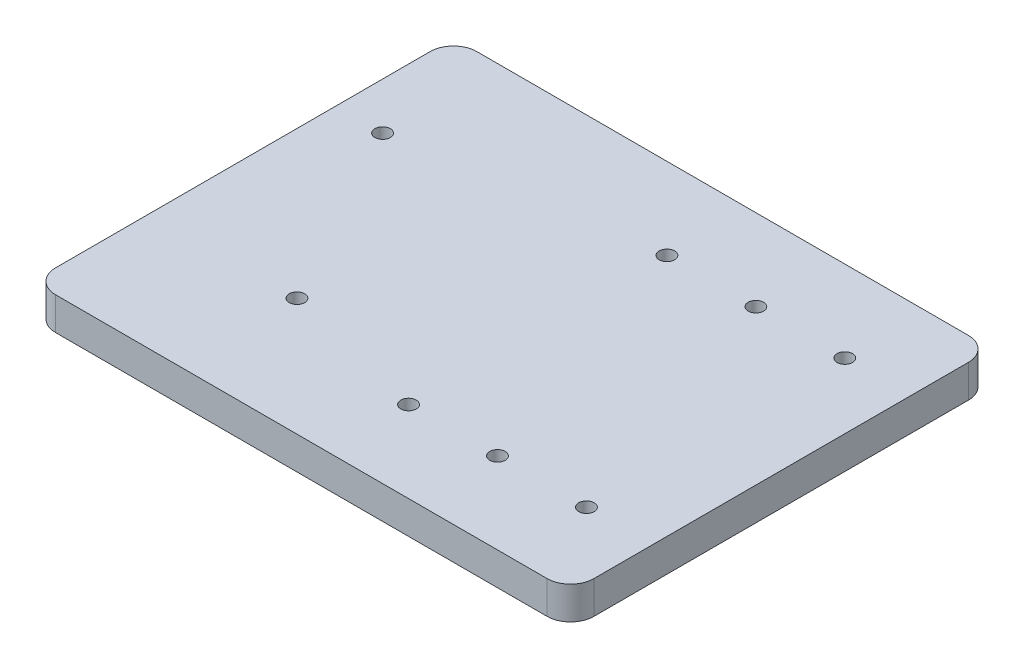
ISO-10303-21;
HEADER;
FILE_DESCRIPTION(('STEP AP214'),'2;1');
FILE_NAME('part.step','',(''),(''),'','','');
FILE_SCHEMA(('AUTOMOTIVE_DESIGN { 1 0 10303 214 1 1 1 1 }'));
ENDSEC;
DATA;
#1=APPLICATION_CONTEXT('core data for automotive mechanical design processes');
#2=APPLICATION_PROTOCOL_DEFINITION('international standard','automotive_design',2000,#1);
#3=PRODUCT_CONTEXT('',#1,'mechanical');
#4=PRODUCT('Part','Part','',(#3));
#5=PRODUCT_RELATED_PRODUCT_CATEGORY('part','',(#4));
#6=PRODUCT_DEFINITION_FORMATION('','',#4);
#7=PRODUCT_DEFINITION_CONTEXT('part definition',#1,'design');
#8=PRODUCT_DEFINITION('design','',#6,#7);
#9=PRODUCT_DEFINITION_SHAPE('','',#8);
#10=(LENGTH_UNIT() NAMED_UNIT(*) SI_UNIT(.MILLI.,.METRE.));
#11=(NAMED_UNIT(*) PLANE_ANGLE_UNIT() SI_UNIT($,.RADIAN.));
#12=(NAMED_UNIT(*) SI_UNIT($,.STERADIAN.) SOLID_ANGLE_UNIT());
#13=UNCERTAINTY_MEASURE_WITH_UNIT(LENGTH_MEASURE(1.E-05),#10,'distance_accuracy_value','');
#14=(GEOMETRIC_REPRESENTATION_CONTEXT(3) GLOBAL_UNCERTAINTY_ASSIGNED_CONTEXT((#13)) GLOBAL_UNIT_ASSIGNED_CONTEXT((#10,
#11,#12)) REPRESENTATION_CONTEXT('',''));
#15=CARTESIAN_POINT('',(0.,0.,0.));
#16=DIRECTION('',(0.,0.,1.));
#17=DIRECTION('',(1.,0.,0.));
#18=AXIS2_PLACEMENT_3D('',#15,#16,#17);
#19=CARTESIAN_POINT('',(10.,7.,-64.85));
#20=DIRECTION('',(0.,-1.,0.));
#21=DIRECTION('',(0.,0.,-1.));
#22=AXIS2_PLACEMENT_3D('',#19,#20,#21);
#23=CYLINDRICAL_SURFACE('',#22,1.65);
#24=CARTESIAN_POINT('',(10.,7.,-64.85));
#25=DIRECTION('',(0.,1.,0.));
#26=DIRECTION('',(0.,0.,1.));
#27=AXIS2_PLACEMENT_3D('',#24,#25,#26);
#28=CIRCLE('',#27,1.65);
#29=CARTESIAN_POINT('',(10.,7.,-63.2));
#30=VERTEX_POINT('',#29);
#31=EDGE_CURVE('E208',#30,#30,#28,.T.);
#32=ORIENTED_EDGE('',*,*,#31,.T.);
#33=EDGE_LOOP('',(#32));
#34=FACE_BOUND('',#33,.T.);
#35=CARTESIAN_POINT('',(10.,4.,-64.85));
#36=DIRECTION('',(0.,-1.,0.));
#37=DIRECTION('',(0.,0.,-1.));
#38=AXIS2_PLACEMENT_3D('',#35,#36,#37);
#39=CIRCLE('',#38,1.65);
#40=CARTESIAN_POINT('',(10.,4.,-66.5));
#41=VERTEX_POINT('',#40);
#42=EDGE_CURVE('E36',#41,#41,#39,.T.);
#43=ORIENTED_EDGE('',*,*,#42,.T.);
#44=EDGE_LOOP('',(#43));
#45=FACE_BOUND('',#44,.T.);
#46=ADVANCED_FACE('F32',(#34,#45),#23,.F.);
#47=CARTESIAN_POINT('',(31.4,7.,-25.15));
#48=DIRECTION('',(0.,-1.,0.));
#49=DIRECTION('',(0.,0.,-1.));
#50=AXIS2_PLACEMENT_3D('',#47,#48,#49);
#51=CYLINDRICAL_SURFACE('',#50,1.65);
#52=CARTESIAN_POINT('',(31.4,7.,-25.15));
#53=DIRECTION('',(0.,1.,0.));
#54=DIRECTION('',(0.,0.,1.));
#55=AXIS2_PLACEMENT_3D('',#52,#53,#54);
#56=CIRCLE('',#55,1.65);
#57=CARTESIAN_POINT('',(31.4,7.,-23.5));
#58=VERTEX_POINT('',#57);
#59=EDGE_CURVE('E205',#58,#58,#56,.T.);
#60=ORIENTED_EDGE('',*,*,#59,.T.);
#61=EDGE_LOOP('',(#60));
#62=FACE_BOUND('',#61,.T.);
#63=CARTESIAN_POINT('',(31.4,4.,-25.15));
#64=DIRECTION('',(0.,-1.,0.));
#65=DIRECTION('',(0.,0.,-1.));
#66=AXIS2_PLACEMENT_3D('',#63,#64,#65);
#67=CIRCLE('',#66,1.65);
#68=CARTESIAN_POINT('',(31.4,4.,-26.8));
#69=VERTEX_POINT('',#68);
#70=EDGE_CURVE('E174',#69,#69,#67,.T.);
#71=ORIENTED_EDGE('',*,*,#70,.T.);
#72=EDGE_LOOP('',(#71));
#73=FACE_BOUND('',#72,.T.);
#74=ADVANCED_FACE('F242',(#62,#73),#51,.F.);
#75=CARTESIAN_POINT('',(101.,7.,-17.4));
#76=DIRECTION('',(0.,-1.,0.));
#77=DIRECTION('',(0.,0.,-1.));
#78=AXIS2_PLACEMENT_3D('',#75,#76,#77);
#79=CYLINDRICAL_SURFACE('',#78,1.65);
#80=CARTESIAN_POINT('',(101.,7.,-17.4));
#81=DIRECTION('',(0.,-1.,0.));
#82=DIRECTION('',(0.,0.,-1.));
#83=AXIS2_PLACEMENT_3D('',#80,#81,#82);
#84=CIRCLE('',#83,1.65);
#85=CARTESIAN_POINT('',(101.,7.,-19.05));
#86=VERTEX_POINT('',#85);
#87=EDGE_CURVE('E200',#86,#86,#84,.T.);
#88=ORIENTED_EDGE('',*,*,#87,.F.);
#89=EDGE_LOOP('',(#88));
#90=FACE_BOUND('',#89,.T.);
#91=CARTESIAN_POINT('',(101.,4.,-17.4));
#92=DIRECTION('',(0.,-1.,0.));
#93=DIRECTION('',(0.,0.,-1.));
#94=AXIS2_PLACEMENT_3D('',#91,#92,#93);
#95=CIRCLE('',#94,1.65);
#96=CARTESIAN_POINT('',(101.,4.,-19.05));
#97=VERTEX_POINT('',#96);
#98=EDGE_CURVE('E172',#97,#97,#95,.F.);
#99=ORIENTED_EDGE('',*,*,#98,.F.);
#100=EDGE_LOOP('',(#99));
#101=FACE_BOUND('',#100,.T.);
#102=ADVANCED_FACE('F248',(#90,#101),#79,.F.);
#103=CARTESIAN_POINT('',(63.,7.,-72.6));
#104=DIRECTION('',(0.,-1.,0.));
#105=DIRECTION('',(0.,0.,-1.));
#106=AXIS2_PLACEMENT_3D('',#103,#104,#105);
#107=CYLINDRICAL_SURFACE('',#106,1.65);
#108=CARTESIAN_POINT('',(63.,7.,-72.6));
#109=DIRECTION('',(0.,-1.,0.));
#110=DIRECTION('',(0.,0.,-1.));
#111=AXIS2_PLACEMENT_3D('',#108,#109,#110);
#112=CIRCLE('',#111,1.65);
#113=CARTESIAN_POINT('',(63.,7.,-74.25));
#114=VERTEX_POINT('',#113);
#115=EDGE_CURVE('E179',#114,#114,#112,.T.);
#116=ORIENTED_EDGE('',*,*,#115,.F.);
#117=EDGE_LOOP('',(#116));
#118=FACE_BOUND('',#117,.T.);
#119=CARTESIAN_POINT('',(63.,4.,-72.6));
#120=DIRECTION('',(0.,-1.,0.));
#121=DIRECTION('',(0.,0.,-1.));
#122=AXIS2_PLACEMENT_3D('',#119,#120,#121);
#123=CIRCLE('',#122,1.65);
#124=CARTESIAN_POINT('',(63.,4.,-74.25));
#125=VERTEX_POINT('',#124);
#126=EDGE_CURVE('E169',#125,#125,#123,.F.);
#127=ORIENTED_EDGE('',*,*,#126,.F.);
#128=EDGE_LOOP('',(#127));
#129=FACE_BOUND('',#128,.T.);
#130=ADVANCED_FACE('F326',(#118,#129),#107,.F.);
#131=CARTESIAN_POINT('',(101.,7.,-72.6));
#132=DIRECTION('',(0.,-1.,0.));
#133=DIRECTION('',(0.,0.,-1.));
#134=AXIS2_PLACEMENT_3D('',#131,#132,#133);
#135=CYLINDRICAL_SURFACE('',#134,1.65);
#136=CARTESIAN_POINT('',(101.,7.,-72.6));
#137=DIRECTION('',(0.,-1.,0.));
#138=DIRECTION('',(0.,0.,-1.));
#139=AXIS2_PLACEMENT_3D('',#136,#137,#138);
#140=CIRCLE('',#139,1.65);
#141=CARTESIAN_POINT('',(101.,7.,-74.25));
#142=VERTEX_POINT('',#141);
#143=EDGE_CURVE('E197',#142,#142,#140,.T.);
#144=ORIENTED_EDGE('',*,*,#143,.F.);
#145=EDGE_LOOP('',(#144));
#146=FACE_BOUND('',#145,.T.);
#147=CARTESIAN_POINT('',(101.,4.,-72.6));
#148=DIRECTION('',(0.,-1.,0.));
#149=DIRECTION('',(0.,0.,-1.));
#150=AXIS2_PLACEMENT_3D('',#147,#148,#149);
#151=CIRCLE('',#150,1.65);
#152=CARTESIAN_POINT('',(101.,4.,-74.25));
#153=VERTEX_POINT('',#152);
#154=EDGE_CURVE('E166',#153,#153,#151,.F.);
#155=ORIENTED_EDGE('',*,*,#154,.F.);
#156=EDGE_LOOP('',(#155));
#157=FACE_BOUND('',#156,.T.);
#158=ADVANCED_FACE('F329',(#146,#157),#135,.F.);
#159=CARTESIAN_POINT('',(82.,7.,-17.4));
#160=DIRECTION('',(0.,-1.,0.));
#161=DIRECTION('',(0.,0.,-1.));
#162=AXIS2_PLACEMENT_3D('',#159,#160,#161);
#163=CYLINDRICAL_SURFACE('',#162,1.65);
#164=CARTESIAN_POINT('',(82.,7.,-17.4));
#165=DIRECTION('',(0.,-1.,0.));
#166=DIRECTION('',(0.,0.,-1.));
#167=AXIS2_PLACEMENT_3D('',#164,#165,#166);
#168=CIRCLE('',#167,1.65);
#169=CARTESIAN_POINT('',(82.,7.,-19.05));
#170=VERTEX_POINT('',#169);
#171=EDGE_CURVE('E195',#170,#170,#168,.T.);
#172=ORIENTED_EDGE('',*,*,#171,.F.);
#173=EDGE_LOOP('',(#172));
#174=FACE_BOUND('',#173,.T.);
#175=CARTESIAN_POINT('',(82.,4.,-17.4));
#176=DIRECTION('',(0.,-1.,0.));
#177=DIRECTION('',(0.,0.,-1.));
#178=AXIS2_PLACEMENT_3D('',#175,#176,#177);
#179=CIRCLE('',#178,1.65);
#180=CARTESIAN_POINT('',(82.,4.,-19.05));
#181=VERTEX_POINT('',#180);
#182=EDGE_CURVE('E163',#181,#181,#179,.F.);
#183=ORIENTED_EDGE('',*,*,#182,.F.);
#184=EDGE_LOOP('',(#183));
#185=FACE_BOUND('',#184,.T.);
#186=ADVANCED_FACE('F334',(#174,#185),#163,.F.);
#187=CARTESIAN_POINT('',(82.,7.,-72.6));
#188=DIRECTION('',(0.,-1.,0.));
#189=DIRECTION('',(0.,0.,-1.));
#190=AXIS2_PLACEMENT_3D('',#187,#188,#189);
#191=CYLINDRICAL_SURFACE('',#190,1.65);
#192=CARTESIAN_POINT('',(82.,7.,-72.6));
#193=DIRECTION('',(0.,-1.,0.));
#194=DIRECTION('',(0.,0.,-1.));
#195=AXIS2_PLACEMENT_3D('',#192,#193,#194);
#196=CIRCLE('',#195,1.65);
#197=CARTESIAN_POINT('',(82.,7.,-74.25));
#198=VERTEX_POINT('',#197);
#199=EDGE_CURVE('E188',#198,#198,#196,.T.);
#200=ORIENTED_EDGE('',*,*,#199,.F.);
#201=EDGE_LOOP('',(#200));
#202=FACE_BOUND('',#201,.T.);
#203=CARTESIAN_POINT('',(82.,4.,-72.6));
#204=DIRECTION('',(0.,-1.,0.));
#205=DIRECTION('',(0.,0.,-1.));
#206=AXIS2_PLACEMENT_3D('',#203,#204,#205);
#207=CIRCLE('',#206,1.65);
#208=CARTESIAN_POINT('',(82.,4.,-74.25));
#209=VERTEX_POINT('',#208);
#210=EDGE_CURVE('E159',#209,#209,#207,.F.);
#211=ORIENTED_EDGE('',*,*,#210,.F.);
#212=EDGE_LOOP('',(#211));
#213=FACE_BOUND('',#212,.T.);
#214=ADVANCED_FACE('F331',(#202,#213),#191,.F.);
#215=CARTESIAN_POINT('',(63.,7.,-17.4));
#216=DIRECTION('',(0.,-1.,0.));
#217=DIRECTION('',(0.,0.,-1.));
#218=AXIS2_PLACEMENT_3D('',#215,#216,#217);
#219=CYLINDRICAL_SURFACE('',#218,1.65);
#220=CARTESIAN_POINT('',(63.,7.,-17.4));
#221=DIRECTION('',(0.,-1.,0.));
#222=DIRECTION('',(0.,0.,-1.));
#223=AXIS2_PLACEMENT_3D('',#220,#221,#222);
#224=CIRCLE('',#223,1.65);
#225=CARTESIAN_POINT('',(63.,7.,-19.05));
#226=VERTEX_POINT('',#225);
#227=EDGE_CURVE('E183',#226,#226,#224,.T.);
#228=ORIENTED_EDGE('',*,*,#227,.F.);
#229=EDGE_LOOP('',(#228));
#230=FACE_BOUND('',#229,.T.);
#231=CARTESIAN_POINT('',(63.,4.,-17.4));
#232=DIRECTION('',(0.,-1.,0.));
#233=DIRECTION('',(0.,0.,-1.));
#234=AXIS2_PLACEMENT_3D('',#231,#232,#233);
#235=CIRCLE('',#234,1.65);
#236=CARTESIAN_POINT('',(63.,4.,-19.05));
#237=VERTEX_POINT('',#236);
#238=EDGE_CURVE('E156',#237,#237,#235,.F.);
#239=ORIENTED_EDGE('',*,*,#238,.F.);
#240=EDGE_LOOP('',(#239));
#241=FACE_BOUND('',#240,.T.);
#242=ADVANCED_FACE('F255',(#230,#241),#219,.F.);
#243=CARTESIAN_POINT('',(0.,7.,0.));
#244=DIRECTION('',(0.,-1.,0.));
#245=DIRECTION('',(0.,0.,-1.));
#246=AXIS2_PLACEMENT_3D('',#243,#244,#245);
#247=PLANE('',#246);
#248=ORIENTED_EDGE('',*,*,#227,.T.);
#249=EDGE_LOOP('',(#248));
#250=FACE_BOUND('',#249,.T.);
#251=ORIENTED_EDGE('',*,*,#199,.T.);
#252=EDGE_LOOP('',(#251));
#253=FACE_BOUND('',#252,.T.);
#254=ORIENTED_EDGE('',*,*,#171,.T.);
#255=EDGE_LOOP('',(#254));
#256=FACE_BOUND('',#255,.T.);
#257=ORIENTED_EDGE('',*,*,#143,.T.);
#258=EDGE_LOOP('',(#257));
#259=FACE_BOUND('',#258,.T.);
#260=ORIENTED_EDGE('',*,*,#115,.T.);
#261=EDGE_LOOP('',(#260));
#262=FACE_BOUND('',#261,.T.);
#263=ORIENTED_EDGE('',*,*,#87,.T.);
#264=EDGE_LOOP('',(#263));
#265=FACE_BOUND('',#264,.T.);
#266=DIRECTION('',(1.,0.,0.));
#267=VECTOR('',#266,1.);
#268=CARTESIAN_POINT('',(0.,7.,0.));
#269=LINE('',#268,#267);
#270=CARTESIAN_POINT('',(5.,7.,0.));
#271=VERTEX_POINT('',#270);
#272=CARTESIAN_POINT('',(110.,7.,0.));
#273=VERTEX_POINT('',#272);
#274=EDGE_CURVE('E213',#271,#273,#269,.T.);
#275=ORIENTED_EDGE('',*,*,#274,.T.);
#276=CARTESIAN_POINT('',(110.,7.,-5.));
#277=DIRECTION('',(0.,-1.,0.));
#278=DIRECTION('',(0.,0.,-1.));
#279=AXIS2_PLACEMENT_3D('',#276,#277,#278);
#280=CIRCLE('',#279,5.);
#281=CARTESIAN_POINT('',(115.,7.,-5.));
#282=VERTEX_POINT('',#281);
#283=EDGE_CURVE('E149',#273,#282,#280,.F.);
#284=ORIENTED_EDGE('',*,*,#283,.T.);
#285=DIRECTION('',(0.,0.,-1.));
#286=VECTOR('',#285,1.);
#287=CARTESIAN_POINT('',(115.,7.,0.));
#288=LINE('',#287,#286);
#289=CARTESIAN_POINT('',(115.,7.,-85.));
#290=VERTEX_POINT('',#289);
#291=EDGE_CURVE('E120',#282,#290,#288,.T.);
#292=ORIENTED_EDGE('',*,*,#291,.T.);
#293=CARTESIAN_POINT('',(110.,7.,-85.));
#294=DIRECTION('',(0.,-1.,0.));
#295=DIRECTION('',(0.,0.,-1.));
#296=AXIS2_PLACEMENT_3D('',#293,#294,#295);
#297=CIRCLE('',#296,5.);
#298=CARTESIAN_POINT('',(110.,7.,-90.));
#299=VERTEX_POINT('',#298);
#300=EDGE_CURVE('E56',#290,#299,#297,.F.);
#301=ORIENTED_EDGE('',*,*,#300,.T.);
#302=DIRECTION('',(-1.,0.,0.));
#303=VECTOR('',#302,1.);
#304=CARTESIAN_POINT('',(0.,7.,-90.));
#305=LINE('',#304,#303);
#306=CARTESIAN_POINT('',(5.,7.,-90.));
#307=VERTEX_POINT('',#306);
#308=EDGE_CURVE('E135',#299,#307,#305,.T.);
#309=ORIENTED_EDGE('',*,*,#308,.T.);
#310=CARTESIAN_POINT('',(5.,7.,-85.));
#311=DIRECTION('',(0.,-1.,0.));
#312=DIRECTION('',(0.,0.,-1.));
#313=AXIS2_PLACEMENT_3D('',#310,#311,#312);
#314=CIRCLE('',#313,5.);
#315=CARTESIAN_POINT('',(0.,7.,-85.));
#316=VERTEX_POINT('',#315);
#317=EDGE_CURVE('E146',#307,#316,#314,.F.);
#318=ORIENTED_EDGE('',*,*,#317,.T.);
#319=DIRECTION('',(0.,0.,1.));
#320=VECTOR('',#319,1.);
#321=CARTESIAN_POINT('',(0.,7.,0.));
#322=LINE('',#321,#320);
#323=CARTESIAN_POINT('',(0.,7.,-5.));
#324=VERTEX_POINT('',#323);
#325=EDGE_CURVE('E129',#316,#324,#322,.T.);
#326=ORIENTED_EDGE('',*,*,#325,.T.);
#327=CARTESIAN_POINT('',(5.,7.,-5.));
#328=DIRECTION('',(0.,-1.,0.));
#329=DIRECTION('',(0.,0.,-1.));
#330=AXIS2_PLACEMENT_3D('',#327,#328,#329);
#331=CIRCLE('',#330,5.);
#332=EDGE_CURVE('E144',#324,#271,#331,.F.);
#333=ORIENTED_EDGE('',*,*,#332,.T.);
#334=EDGE_LOOP('',(#275,#284,#292,#301,#309,#318,#326,#333));
#335=FACE_BOUND('',#334,.T.);
#336=ORIENTED_EDGE('',*,*,#31,.F.);
#337=EDGE_LOOP('',(#336));
#338=FACE_BOUND('',#337,.T.);
#339=ORIENTED_EDGE('',*,*,#59,.F.);
#340=EDGE_LOOP('',(#339));
#341=FACE_BOUND('',#340,.T.);
#342=ADVANCED_FACE('F228',(#250,#253,#256,#259,#262,#265,#335,#338,#341),#247,.F.);
#343=CARTESIAN_POINT('',(0.,0.,0.));
#344=DIRECTION('',(0.,-1.,0.));
#345=DIRECTION('',(0.,0.,-1.));
#346=AXIS2_PLACEMENT_3D('',#343,#344,#345);
#347=PLANE('',#346);
#348=CARTESIAN_POINT('',(101.,0.,-17.4));
#349=DIRECTION('',(0.,-1.,0.));
#350=DIRECTION('',(0.,0.,-1.));
#351=AXIS2_PLACEMENT_3D('',#348,#349,#350);
#352=CIRCLE('',#351,3.50000000000001);
#353=CARTESIAN_POINT('',(101.,0.,-20.9));
#354=VERTEX_POINT('',#353);
#355=EDGE_CURVE('E603',#354,#354,#352,.T.);
#356=ORIENTED_EDGE('',*,*,#355,.F.);
#357=EDGE_LOOP('',(#356));
#358=FACE_BOUND('',#357,.T.);
#359=CARTESIAN_POINT('',(82.,0.,-17.4));
#360=DIRECTION('',(0.,-1.,0.));
#361=DIRECTION('',(0.,0.,-1.));
#362=AXIS2_PLACEMENT_3D('',#359,#360,#361);
#363=CIRCLE('',#362,3.50000000000001);
#364=CARTESIAN_POINT('',(82.,0.,-20.9));
#365=VERTEX_POINT('',#364);
#366=EDGE_CURVE('E597',#365,#365,#363,.T.);
#367=ORIENTED_EDGE('',*,*,#366,.F.);
#368=EDGE_LOOP('',(#367));
#369=FACE_BOUND('',#368,.T.);
#370=CARTESIAN_POINT('',(63.,0.,-17.4));
#371=DIRECTION('',(0.,-1.,0.));
#372=DIRECTION('',(0.,0.,-1.));
#373=AXIS2_PLACEMENT_3D('',#370,#371,#372);
#374=CIRCLE('',#373,3.50000000000001);
#375=CARTESIAN_POINT('',(63.,0.,-20.9));
#376=VERTEX_POINT('',#375);
#377=EDGE_CURVE('E591',#376,#376,#374,.T.);
#378=ORIENTED_EDGE('',*,*,#377,.F.);
#379=EDGE_LOOP('',(#378));
#380=FACE_BOUND('',#379,.T.);
#381=CARTESIAN_POINT('',(101.,0.,-72.6));
#382=DIRECTION('',(0.,-1.,0.));
#383=DIRECTION('',(0.,0.,-1.));
#384=AXIS2_PLACEMENT_3D('',#381,#382,#383);
#385=CIRCLE('',#384,3.50000000000001);
#386=CARTESIAN_POINT('',(101.,0.,-76.1));
#387=VERTEX_POINT('',#386);
#388=EDGE_CURVE('E586',#387,#387,#385,.T.);
#389=ORIENTED_EDGE('',*,*,#388,.F.);
#390=EDGE_LOOP('',(#389));
#391=FACE_BOUND('',#390,.T.);
#392=CARTESIAN_POINT('',(82.,0.,-72.6));
#393=DIRECTION('',(0.,-1.,0.));
#394=DIRECTION('',(0.,0.,-1.));
#395=AXIS2_PLACEMENT_3D('',#392,#393,#394);
#396=CIRCLE('',#395,3.50000000000001);
#397=CARTESIAN_POINT('',(82.,0.,-76.1));
#398=VERTEX_POINT('',#397);
#399=EDGE_CURVE('E580',#398,#398,#396,.T.);
#400=ORIENTED_EDGE('',*,*,#399,.F.);
#401=EDGE_LOOP('',(#400));
#402=FACE_BOUND('',#401,.T.);
#403=CARTESIAN_POINT('',(63.,0.,-72.6));
#404=DIRECTION('',(0.,-1.,0.));
#405=DIRECTION('',(0.,0.,-1.));
#406=AXIS2_PLACEMENT_3D('',#403,#404,#405);
#407=CIRCLE('',#406,3.50000000000001);
#408=CARTESIAN_POINT('',(63.,0.,-76.1));
#409=VERTEX_POINT('',#408);
#410=EDGE_CURVE('E574',#409,#409,#407,.T.);
#411=ORIENTED_EDGE('',*,*,#410,.F.);
#412=EDGE_LOOP('',(#411));
#413=FACE_BOUND('',#412,.T.);
#414=CARTESIAN_POINT('',(10.,0.,-64.85));
#415=DIRECTION('',(0.,-1.,0.));
#416=DIRECTION('',(0.,0.,-1.));
#417=AXIS2_PLACEMENT_3D('',#414,#415,#416);
#418=CIRCLE('',#417,3.5);
#419=CARTESIAN_POINT('',(10.,0.,-68.35));
#420=VERTEX_POINT('',#419);
#421=EDGE_CURVE('E565',#420,#420,#418,.T.);
#422=ORIENTED_EDGE('',*,*,#421,.F.);
#423=EDGE_LOOP('',(#422));
#424=FACE_BOUND('',#423,.T.);
#425=CARTESIAN_POINT('',(31.4,0.,-25.15));
#426=DIRECTION('',(0.,-1.,0.));
#427=DIRECTION('',(0.,0.,-1.));
#428=AXIS2_PLACEMENT_3D('',#425,#426,#427);
#429=CIRCLE('',#428,3.5);
#430=CARTESIAN_POINT('',(31.4,0.,-28.65));
#431=VERTEX_POINT('',#430);
#432=EDGE_CURVE('E192',#431,#431,#429,.T.);
#433=ORIENTED_EDGE('',*,*,#432,.F.);
#434=EDGE_LOOP('',(#433));
#435=FACE_BOUND('',#434,.T.);
#436=DIRECTION('',(0.,0.,-1.));
#437=VECTOR('',#436,1.);
#438=CARTESIAN_POINT('',(115.,0.,0.));
#439=LINE('',#438,#437);
#440=CARTESIAN_POINT('',(115.,0.,-5.));
#441=VERTEX_POINT('',#440);
#442=CARTESIAN_POINT('',(115.,0.,-85.));
#443=VERTEX_POINT('',#442);
#444=EDGE_CURVE('E118',#441,#443,#439,.T.);
#445=ORIENTED_EDGE('',*,*,#444,.F.);
#446=CARTESIAN_POINT('',(110.,0.,-5.));
#447=DIRECTION('',(0.,-1.,0.));
#448=DIRECTION('',(0.,0.,-1.));
#449=AXIS2_PLACEMENT_3D('',#446,#447,#448);
#450=CIRCLE('',#449,5.);
#451=CARTESIAN_POINT('',(110.,0.,0.));
#452=VERTEX_POINT('',#451);
#453=EDGE_CURVE('E101',#441,#452,#450,.T.);
#454=ORIENTED_EDGE('',*,*,#453,.T.);
#455=DIRECTION('',(1.,0.,0.));
#456=VECTOR('',#455,1.);
#457=CARTESIAN_POINT('',(0.,0.,0.));
#458=LINE('',#457,#456);
#459=CARTESIAN_POINT('',(5.,0.,0.));
#460=VERTEX_POINT('',#459);
#461=EDGE_CURVE('E127',#460,#452,#458,.T.);
#462=ORIENTED_EDGE('',*,*,#461,.F.);
#463=CARTESIAN_POINT('',(5.,0.,-5.));
#464=DIRECTION('',(0.,-1.,0.));
#465=DIRECTION('',(0.,0.,-1.));
#466=AXIS2_PLACEMENT_3D('',#463,#464,#465);
#467=CIRCLE('',#466,5.);
#468=CARTESIAN_POINT('',(0.,0.,-5.));
#469=VERTEX_POINT('',#468);
#470=EDGE_CURVE('E121',#460,#469,#467,.T.);
#471=ORIENTED_EDGE('',*,*,#470,.T.);
#472=DIRECTION('',(0.,0.,1.));
#473=VECTOR('',#472,1.);
#474=CARTESIAN_POINT('',(0.,0.,0.));
#475=LINE('',#474,#473);
#476=CARTESIAN_POINT('',(0.,0.,-85.));
#477=VERTEX_POINT('',#476);
#478=EDGE_CURVE('E131',#477,#469,#475,.T.);
#479=ORIENTED_EDGE('',*,*,#478,.F.);
#480=CARTESIAN_POINT('',(5.,0.,-85.));
#481=DIRECTION('',(0.,-1.,0.));
#482=DIRECTION('',(0.,0.,-1.));
#483=AXIS2_PLACEMENT_3D('',#480,#481,#482);
#484=CIRCLE('',#483,5.);
#485=CARTESIAN_POINT('',(5.,0.,-90.));
#486=VERTEX_POINT('',#485);
#487=EDGE_CURVE('E138',#477,#486,#484,.T.);
#488=ORIENTED_EDGE('',*,*,#487,.T.);
#489=DIRECTION('',(-1.,0.,0.));
#490=VECTOR('',#489,1.);
#491=CARTESIAN_POINT('',(0.,0.,-90.));
#492=LINE('',#491,#490);
#493=CARTESIAN_POINT('',(110.,0.,-90.));
#494=VERTEX_POINT('',#493);
#495=EDGE_CURVE('E126',#494,#486,#492,.T.);
#496=ORIENTED_EDGE('',*,*,#495,.F.);
#497=CARTESIAN_POINT('',(110.,0.,-85.));
#498=DIRECTION('',(0.,-1.,0.));
#499=DIRECTION('',(0.,0.,-1.));
#500=AXIS2_PLACEMENT_3D('',#497,#498,#499);
#501=CIRCLE('',#500,5.);
#502=EDGE_CURVE('E112',#494,#443,#501,.T.);
#503=ORIENTED_EDGE('',*,*,#502,.T.);
#504=EDGE_LOOP('',(#445,#454,#462,#471,#479,#488,#496,#503));
#505=FACE_BOUND('',#504,.T.);
#506=ADVANCED_FACE('F124',(#358,#369,#380,#391,#402,#413,#424,#435,#505),#347,.T.);
#507=CARTESIAN_POINT('',(0.,7.,0.));
#508=DIRECTION('',(1.,0.,0.));
#509=DIRECTION('',(0.,0.,-1.));
#510=AXIS2_PLACEMENT_3D('',#507,#508,#509);
#511=PLANE('',#510);
#512=ORIENTED_EDGE('',*,*,#325,.F.);
#513=DIRECTION('',(0.,-1.,0.));
#514=VECTOR('',#513,1.);
#515=CARTESIAN_POINT('',(0.,7.,-85.));
#516=LINE('',#515,#514);
#517=EDGE_CURVE('E11',#316,#477,#516,.T.);
#518=ORIENTED_EDGE('',*,*,#517,.T.);
#519=ORIENTED_EDGE('',*,*,#478,.T.);
#520=DIRECTION('',(0.,-1.,0.));
#521=VECTOR('',#520,1.);
#522=CARTESIAN_POINT('',(0.,7.,-5.));
#523=LINE('',#522,#521);
#524=EDGE_CURVE('E41',#469,#324,#523,.F.);
#525=ORIENTED_EDGE('',*,*,#524,.T.);
#526=EDGE_LOOP('',(#512,#518,#519,#525));
#527=FACE_BOUND('',#526,.T.);
#528=ADVANCED_FACE('F222',(#527),#511,.F.);
#529=CARTESIAN_POINT('',(0.,7.,0.));
#530=DIRECTION('',(0.,0.,-1.));
#531=DIRECTION('',(-1.,0.,0.));
#532=AXIS2_PLACEMENT_3D('',#529,#530,#531);
#533=PLANE('',#532);
#534=ORIENTED_EDGE('',*,*,#461,.T.);
#535=DIRECTION('',(0.,-1.,0.));
#536=VECTOR('',#535,1.);
#537=CARTESIAN_POINT('',(110.,7.,0.));
#538=LINE('',#537,#536);
#539=EDGE_CURVE('E106',#452,#273,#538,.F.);
#540=ORIENTED_EDGE('',*,*,#539,.T.);
#541=ORIENTED_EDGE('',*,*,#274,.F.);
#542=DIRECTION('',(0.,-1.,0.));
#543=VECTOR('',#542,1.);
#544=CARTESIAN_POINT('',(5.,7.,0.));
#545=LINE('',#544,#543);
#546=EDGE_CURVE('E111',#271,#460,#545,.T.);
#547=ORIENTED_EDGE('',*,*,#546,.T.);
#548=EDGE_LOOP('',(#534,#540,#541,#547));
#549=FACE_BOUND('',#548,.T.);
#550=ADVANCED_FACE('F231',(#549),#533,.F.);
#551=CARTESIAN_POINT('',(115.,7.,0.));
#552=DIRECTION('',(-1.,0.,0.));
#553=DIRECTION('',(0.,0.,1.));
#554=AXIS2_PLACEMENT_3D('',#551,#552,#553);
#555=PLANE('',#554);
#556=ORIENTED_EDGE('',*,*,#291,.F.);
#557=DIRECTION('',(0.,-1.,0.));
#558=VECTOR('',#557,1.);
#559=CARTESIAN_POINT('',(115.,7.,-5.));
#560=LINE('',#559,#558);
#561=EDGE_CURVE('E105',#282,#441,#560,.T.);
#562=ORIENTED_EDGE('',*,*,#561,.T.);
#563=ORIENTED_EDGE('',*,*,#444,.T.);
#564=DIRECTION('',(0.,-1.,0.));
#565=VECTOR('',#564,1.);
#566=CARTESIAN_POINT('',(115.,7.,-85.));
#567=LINE('',#566,#565);
#568=EDGE_CURVE('E122',#443,#290,#567,.F.);
#569=ORIENTED_EDGE('',*,*,#568,.T.);
#570=EDGE_LOOP('',(#556,#562,#563,#569));
#571=FACE_BOUND('',#570,.T.);
#572=ADVANCED_FACE('F117',(#571),#555,.F.);
#573=CARTESIAN_POINT('',(0.,7.,-90.));
#574=DIRECTION('',(0.,0.,1.));
#575=DIRECTION('',(1.,0.,0.));
#576=AXIS2_PLACEMENT_3D('',#573,#574,#575);
#577=PLANE('',#576);
#578=ORIENTED_EDGE('',*,*,#308,.F.);
#579=DIRECTION('',(0.,-1.,0.));
#580=VECTOR('',#579,1.);
#581=CARTESIAN_POINT('',(110.,7.,-90.));
#582=LINE('',#581,#580);
#583=EDGE_CURVE('E152',#299,#494,#582,.T.);
#584=ORIENTED_EDGE('',*,*,#583,.T.);
#585=ORIENTED_EDGE('',*,*,#495,.T.);
#586=DIRECTION('',(0.,-1.,0.));
#587=VECTOR('',#586,1.);
#588=CARTESIAN_POINT('',(5.,7.,-90.));
#589=LINE('',#588,#587);
#590=EDGE_CURVE('E49',#486,#307,#589,.F.);
#591=ORIENTED_EDGE('',*,*,#590,.T.);
#592=EDGE_LOOP('',(#578,#584,#585,#591));
#593=FACE_BOUND('',#592,.T.);
#594=ADVANCED_FACE('F238',(#593),#577,.F.);
#595=CARTESIAN_POINT('',(110.,7.,-5.));
#596=DIRECTION('',(0.,-1.,0.));
#597=DIRECTION('',(0.,0.,-1.));
#598=AXIS2_PLACEMENT_3D('',#595,#596,#597);
#599=CYLINDRICAL_SURFACE('',#598,5.);
#600=ORIENTED_EDGE('',*,*,#283,.F.);
#601=ORIENTED_EDGE('',*,*,#539,.F.);
#602=ORIENTED_EDGE('',*,*,#453,.F.);
#603=ORIENTED_EDGE('',*,*,#561,.F.);
#604=EDGE_LOOP('',(#600,#601,#602,#603));
#605=FACE_BOUND('',#604,.T.);
#606=ADVANCED_FACE('F104',(#605),#599,.T.);
#607=CARTESIAN_POINT('',(110.,7.,-85.));
#608=DIRECTION('',(0.,-1.,0.));
#609=DIRECTION('',(0.,0.,-1.));
#610=AXIS2_PLACEMENT_3D('',#607,#608,#609);
#611=CYLINDRICAL_SURFACE('',#610,5.);
#612=ORIENTED_EDGE('',*,*,#300,.F.);
#613=ORIENTED_EDGE('',*,*,#568,.F.);
#614=ORIENTED_EDGE('',*,*,#502,.F.);
#615=ORIENTED_EDGE('',*,*,#583,.F.);
#616=EDGE_LOOP('',(#612,#613,#614,#615));
#617=FACE_BOUND('',#616,.T.);
#618=ADVANCED_FACE('F264',(#617),#611,.T.);
#619=CARTESIAN_POINT('',(5.,7.,-85.));
#620=DIRECTION('',(0.,-1.,0.));
#621=DIRECTION('',(0.,0.,-1.));
#622=AXIS2_PLACEMENT_3D('',#619,#620,#621);
#623=CYLINDRICAL_SURFACE('',#622,5.);
#624=ORIENTED_EDGE('',*,*,#317,.F.);
#625=ORIENTED_EDGE('',*,*,#590,.F.);
#626=ORIENTED_EDGE('',*,*,#487,.F.);
#627=ORIENTED_EDGE('',*,*,#517,.F.);
#628=EDGE_LOOP('',(#624,#625,#626,#627));
#629=FACE_BOUND('',#628,.T.);
#630=ADVANCED_FACE('F270',(#629),#623,.T.);
#631=CARTESIAN_POINT('',(5.,7.,-5.));
#632=DIRECTION('',(0.,-1.,0.));
#633=DIRECTION('',(0.,0.,-1.));
#634=AXIS2_PLACEMENT_3D('',#631,#632,#633);
#635=CYLINDRICAL_SURFACE('',#634,5.);
#636=ORIENTED_EDGE('',*,*,#332,.F.);
#637=ORIENTED_EDGE('',*,*,#524,.F.);
#638=ORIENTED_EDGE('',*,*,#470,.F.);
#639=ORIENTED_EDGE('',*,*,#546,.F.);
#640=EDGE_LOOP('',(#636,#637,#638,#639));
#641=FACE_BOUND('',#640,.T.);
#642=ADVANCED_FACE('F34',(#641),#635,.T.);
#643=CARTESIAN_POINT('',(63.,4.,-17.4));
#644=DIRECTION('',(0.,-1.,0.));
#645=DIRECTION('',(0.,0.,-1.));
#646=AXIS2_PLACEMENT_3D('',#643,#644,#645);
#647=PLANE('',#646);
#648=CARTESIAN_POINT('',(63.,4.,-17.4));
#649=DIRECTION('',(0.,-1.,0.));
#650=DIRECTION('',(0.,0.,-1.));
#651=AXIS2_PLACEMENT_3D('',#648,#649,#650);
#652=CIRCLE('',#651,3.50000000000001);
#653=CARTESIAN_POINT('',(63.,4.,-20.9));
#654=VERTEX_POINT('',#653);
#655=EDGE_CURVE('E589',#654,#654,#652,.T.);
#656=ORIENTED_EDGE('',*,*,#655,.T.);
#657=EDGE_LOOP('',(#656));
#658=FACE_BOUND('',#657,.T.);
#659=ORIENTED_EDGE('',*,*,#238,.T.);
#660=EDGE_LOOP('',(#659));
#661=FACE_BOUND('',#660,.T.);
#662=ADVANCED_FACE('F279',(#658,#661),#647,.T.);
#663=CARTESIAN_POINT('',(63.,4.,-17.4));
#664=DIRECTION('',(0.,-1.,0.));
#665=DIRECTION('',(0.,0.,-1.));
#666=AXIS2_PLACEMENT_3D('',#663,#664,#665);
#667=CYLINDRICAL_SURFACE('',#666,3.50000000000001);
#668=ORIENTED_EDGE('',*,*,#655,.F.);
#669=EDGE_LOOP('',(#668));
#670=FACE_BOUND('',#669,.T.);
#671=ORIENTED_EDGE('',*,*,#377,.T.);
#672=EDGE_LOOP('',(#671));
#673=FACE_BOUND('',#672,.T.);
#674=ADVANCED_FACE('F283',(#670,#673),#667,.F.);
#675=CARTESIAN_POINT('',(82.,4.,-72.6));
#676=DIRECTION('',(0.,-1.,0.));
#677=DIRECTION('',(0.,0.,-1.));
#678=AXIS2_PLACEMENT_3D('',#675,#676,#677);
#679=PLANE('',#678);
#680=CARTESIAN_POINT('',(82.,4.,-72.6));
#681=DIRECTION('',(0.,-1.,0.));
#682=DIRECTION('',(0.,0.,-1.));
#683=AXIS2_PLACEMENT_3D('',#680,#681,#682);
#684=CIRCLE('',#683,3.50000000000001);
#685=CARTESIAN_POINT('',(82.,4.,-76.1));
#686=VERTEX_POINT('',#685);
#687=EDGE_CURVE('E577',#686,#686,#684,.T.);
#688=ORIENTED_EDGE('',*,*,#687,.T.);
#689=EDGE_LOOP('',(#688));
#690=FACE_BOUND('',#689,.T.);
#691=ORIENTED_EDGE('',*,*,#210,.T.);
#692=EDGE_LOOP('',(#691));
#693=FACE_BOUND('',#692,.T.);
#694=ADVANCED_FACE('F289',(#690,#693),#679,.T.);
#695=CARTESIAN_POINT('',(82.,4.,-72.6));
#696=DIRECTION('',(0.,-1.,0.));
#697=DIRECTION('',(0.,0.,-1.));
#698=AXIS2_PLACEMENT_3D('',#695,#696,#697);
#699=CYLINDRICAL_SURFACE('',#698,3.50000000000001);
#700=ORIENTED_EDGE('',*,*,#687,.F.);
#701=EDGE_LOOP('',(#700));
#702=FACE_BOUND('',#701,.T.);
#703=ORIENTED_EDGE('',*,*,#399,.T.);
#704=EDGE_LOOP('',(#703));
#705=FACE_BOUND('',#704,.T.);
#706=ADVANCED_FACE('F302',(#702,#705),#699,.F.);
#707=CARTESIAN_POINT('',(82.,4.,-17.4));
#708=DIRECTION('',(0.,-1.,0.));
#709=DIRECTION('',(0.,0.,-1.));
#710=AXIS2_PLACEMENT_3D('',#707,#708,#709);
#711=PLANE('',#710);
#712=CARTESIAN_POINT('',(82.,4.,-17.4));
#713=DIRECTION('',(0.,-1.,0.));
#714=DIRECTION('',(0.,0.,-1.));
#715=AXIS2_PLACEMENT_3D('',#712,#713,#714);
#716=CIRCLE('',#715,3.50000000000001);
#717=CARTESIAN_POINT('',(82.,4.,-20.9));
#718=VERTEX_POINT('',#717);
#719=EDGE_CURVE('E594',#718,#718,#716,.T.);
#720=ORIENTED_EDGE('',*,*,#719,.T.);
#721=EDGE_LOOP('',(#720));
#722=FACE_BOUND('',#721,.T.);
#723=ORIENTED_EDGE('',*,*,#182,.T.);
#724=EDGE_LOOP('',(#723));
#725=FACE_BOUND('',#724,.T.);
#726=ADVANCED_FACE('F298',(#722,#725),#711,.T.);
#727=CARTESIAN_POINT('',(82.,4.,-17.4));
#728=DIRECTION('',(0.,-1.,0.));
#729=DIRECTION('',(0.,0.,-1.));
#730=AXIS2_PLACEMENT_3D('',#727,#728,#729);
#731=CYLINDRICAL_SURFACE('',#730,3.50000000000001);
#732=ORIENTED_EDGE('',*,*,#719,.F.);
#733=EDGE_LOOP('',(#732));
#734=FACE_BOUND('',#733,.T.);
#735=ORIENTED_EDGE('',*,*,#366,.T.);
#736=EDGE_LOOP('',(#735));
#737=FACE_BOUND('',#736,.T.);
#738=ADVANCED_FACE('F301',(#734,#737),#731,.F.);
#739=CARTESIAN_POINT('',(101.,4.,-72.6));
#740=DIRECTION('',(0.,-1.,0.));
#741=DIRECTION('',(0.,0.,-1.));
#742=AXIS2_PLACEMENT_3D('',#739,#740,#741);
#743=PLANE('',#742);
#744=CARTESIAN_POINT('',(101.,4.,-72.6));
#745=DIRECTION('',(0.,-1.,0.));
#746=DIRECTION('',(0.,0.,-1.));
#747=AXIS2_PLACEMENT_3D('',#744,#745,#746);
#748=CIRCLE('',#747,3.50000000000001);
#749=CARTESIAN_POINT('',(101.,4.,-76.1));
#750=VERTEX_POINT('',#749);
#751=EDGE_CURVE('E583',#750,#750,#748,.T.);
#752=ORIENTED_EDGE('',*,*,#751,.T.);
#753=EDGE_LOOP('',(#752));
#754=FACE_BOUND('',#753,.T.);
#755=ORIENTED_EDGE('',*,*,#154,.T.);
#756=EDGE_LOOP('',(#755));
#757=FACE_BOUND('',#756,.T.);
#758=ADVANCED_FACE('F306',(#754,#757),#743,.T.);
#759=CARTESIAN_POINT('',(101.,4.,-72.6));
#760=DIRECTION('',(0.,-1.,0.));
#761=DIRECTION('',(0.,0.,-1.));
#762=AXIS2_PLACEMENT_3D('',#759,#760,#761);
#763=CYLINDRICAL_SURFACE('',#762,3.50000000000001);
#764=ORIENTED_EDGE('',*,*,#751,.F.);
#765=EDGE_LOOP('',(#764));
#766=FACE_BOUND('',#765,.T.);
#767=ORIENTED_EDGE('',*,*,#388,.T.);
#768=EDGE_LOOP('',(#767));
#769=FACE_BOUND('',#768,.T.);
#770=ADVANCED_FACE('F295',(#766,#769),#763,.F.);
#771=CARTESIAN_POINT('',(63.,4.,-72.6));
#772=DIRECTION('',(0.,-1.,0.));
#773=DIRECTION('',(0.,0.,-1.));
#774=AXIS2_PLACEMENT_3D('',#771,#772,#773);
#775=PLANE('',#774);
#776=CARTESIAN_POINT('',(63.,4.,-72.6));
#777=DIRECTION('',(0.,-1.,0.));
#778=DIRECTION('',(0.,0.,-1.));
#779=AXIS2_PLACEMENT_3D('',#776,#777,#778);
#780=CIRCLE('',#779,3.50000000000001);
#781=CARTESIAN_POINT('',(63.,4.,-76.1));
#782=VERTEX_POINT('',#781);
#783=EDGE_CURVE('E569',#782,#782,#780,.T.);
#784=ORIENTED_EDGE('',*,*,#783,.T.);
#785=EDGE_LOOP('',(#784));
#786=FACE_BOUND('',#785,.T.);
#787=ORIENTED_EDGE('',*,*,#126,.T.);
#788=EDGE_LOOP('',(#787));
#789=FACE_BOUND('',#788,.T.);
#790=ADVANCED_FACE('F491',(#786,#789),#775,.T.);
#791=CARTESIAN_POINT('',(63.,4.,-72.6));
#792=DIRECTION('',(0.,-1.,0.));
#793=DIRECTION('',(0.,0.,-1.));
#794=AXIS2_PLACEMENT_3D('',#791,#792,#793);
#795=CYLINDRICAL_SURFACE('',#794,3.50000000000001);
#796=ORIENTED_EDGE('',*,*,#783,.F.);
#797=EDGE_LOOP('',(#796));
#798=FACE_BOUND('',#797,.T.);
#799=ORIENTED_EDGE('',*,*,#410,.T.);
#800=EDGE_LOOP('',(#799));
#801=FACE_BOUND('',#800,.T.);
#802=ADVANCED_FACE('F312',(#798,#801),#795,.F.);
#803=CARTESIAN_POINT('',(101.,4.,-17.4));
#804=DIRECTION('',(0.,-1.,0.));
#805=DIRECTION('',(0.,0.,-1.));
#806=AXIS2_PLACEMENT_3D('',#803,#804,#805);
#807=PLANE('',#806);
#808=CARTESIAN_POINT('',(101.,4.,-17.4));
#809=DIRECTION('',(0.,-1.,0.));
#810=DIRECTION('',(0.,0.,-1.));
#811=AXIS2_PLACEMENT_3D('',#808,#809,#810);
#812=CIRCLE('',#811,3.50000000000001);
#813=CARTESIAN_POINT('',(101.,4.,-20.9));
#814=VERTEX_POINT('',#813);
#815=EDGE_CURVE('E600',#814,#814,#812,.T.);
#816=ORIENTED_EDGE('',*,*,#815,.T.);
#817=EDGE_LOOP('',(#816));
#818=FACE_BOUND('',#817,.T.);
#819=ORIENTED_EDGE('',*,*,#98,.T.);
#820=EDGE_LOOP('',(#819));
#821=FACE_BOUND('',#820,.T.);
#822=ADVANCED_FACE('F308',(#818,#821),#807,.T.);
#823=CARTESIAN_POINT('',(101.,4.,-17.4));
#824=DIRECTION('',(0.,-1.,0.));
#825=DIRECTION('',(0.,0.,-1.));
#826=AXIS2_PLACEMENT_3D('',#823,#824,#825);
#827=CYLINDRICAL_SURFACE('',#826,3.50000000000001);
#828=ORIENTED_EDGE('',*,*,#815,.F.);
#829=EDGE_LOOP('',(#828));
#830=FACE_BOUND('',#829,.T.);
#831=ORIENTED_EDGE('',*,*,#355,.T.);
#832=EDGE_LOOP('',(#831));
#833=FACE_BOUND('',#832,.T.);
#834=ADVANCED_FACE('F311',(#830,#833),#827,.F.);
#835=CARTESIAN_POINT('',(31.4,4.,-25.15));
#836=DIRECTION('',(0.,-1.,0.));
#837=DIRECTION('',(0.,0.,-1.));
#838=AXIS2_PLACEMENT_3D('',#835,#836,#837);
#839=CYLINDRICAL_SURFACE('',#838,3.5);
#840=CARTESIAN_POINT('',(31.4,4.,-25.15));
#841=DIRECTION('',(0.,-1.,0.));
#842=DIRECTION('',(0.,0.,-1.));
#843=AXIS2_PLACEMENT_3D('',#840,#841,#842);
#844=CIRCLE('',#843,3.5);
#845=CARTESIAN_POINT('',(31.4,4.,-28.65));
#846=VERTEX_POINT('',#845);
#847=EDGE_CURVE('E160',#846,#846,#844,.T.);
#848=ORIENTED_EDGE('',*,*,#847,.F.);
#849=EDGE_LOOP('',(#848));
#850=FACE_BOUND('',#849,.T.);
#851=ORIENTED_EDGE('',*,*,#432,.T.);
#852=EDGE_LOOP('',(#851));
#853=FACE_BOUND('',#852,.T.);
#854=ADVANCED_FACE('F316',(#850,#853),#839,.F.);
#855=CARTESIAN_POINT('',(31.4,4.,-25.15));
#856=DIRECTION('',(0.,-1.,0.));
#857=DIRECTION('',(0.,0.,-1.));
#858=AXIS2_PLACEMENT_3D('',#855,#856,#857);
#859=PLANE('',#858);
#860=ORIENTED_EDGE('',*,*,#70,.F.);
#861=EDGE_LOOP('',(#860));
#862=FACE_BOUND('',#861,.T.);
#863=ORIENTED_EDGE('',*,*,#847,.T.);
#864=EDGE_LOOP('',(#863));
#865=FACE_BOUND('',#864,.T.);
#866=ADVANCED_FACE('F318',(#862,#865),#859,.T.);
#867=CARTESIAN_POINT('',(10.,4.,-64.85));
#868=DIRECTION('',(0.,-1.,0.));
#869=DIRECTION('',(0.,0.,-1.));
#870=AXIS2_PLACEMENT_3D('',#867,#868,#869);
#871=CYLINDRICAL_SURFACE('',#870,3.5);
#872=CARTESIAN_POINT('',(10.,4.,-64.85));
#873=DIRECTION('',(0.,-1.,0.));
#874=DIRECTION('',(0.,0.,-1.));
#875=AXIS2_PLACEMENT_3D('',#872,#873,#874);
#876=CIRCLE('',#875,3.5);
#877=CARTESIAN_POINT('',(10.,4.,-68.35));
#878=VERTEX_POINT('',#877);
#879=EDGE_CURVE('E564',#878,#878,#876,.T.);
#880=ORIENTED_EDGE('',*,*,#879,.F.);
#881=EDGE_LOOP('',(#880));
#882=FACE_BOUND('',#881,.T.);
#883=ORIENTED_EDGE('',*,*,#421,.T.);
#884=EDGE_LOOP('',(#883));
#885=FACE_BOUND('',#884,.T.);
#886=ADVANCED_FACE('F321',(#882,#885),#871,.F.);
#887=CARTESIAN_POINT('',(10.,4.,-64.85));
#888=DIRECTION('',(0.,-1.,0.));
#889=DIRECTION('',(0.,0.,-1.));
#890=AXIS2_PLACEMENT_3D('',#887,#888,#889);
#891=PLANE('',#890);
#892=ORIENTED_EDGE('',*,*,#42,.F.);
#893=EDGE_LOOP('',(#892));
#894=FACE_BOUND('',#893,.T.);
#895=ORIENTED_EDGE('',*,*,#879,.T.);
#896=EDGE_LOOP('',(#895));
#897=FACE_BOUND('',#896,.T.);
#898=ADVANCED_FACE('F535',(#894,#897),#891,.T.);
#899=CLOSED_SHELL('',(#46,#74,#102,#130,#158,#186,#214,#242,#342,#506,#528,#550,#572,#594,#606,
#618,#630,#642,#662,#674,#694,#706,#726,#738,#758,#770,#790,#802,#822,#834,#854,#866,#886,#898));
#900=MANIFOLD_SOLID_BREP('B2',#899);
#901=ADVANCED_BREP_SHAPE_REPRESENTATION('',(#18,#900),#14);
#902=SHAPE_DEFINITION_REPRESENTATION(#9,#901);
ENDSEC;
END-ISO-10303-21;
